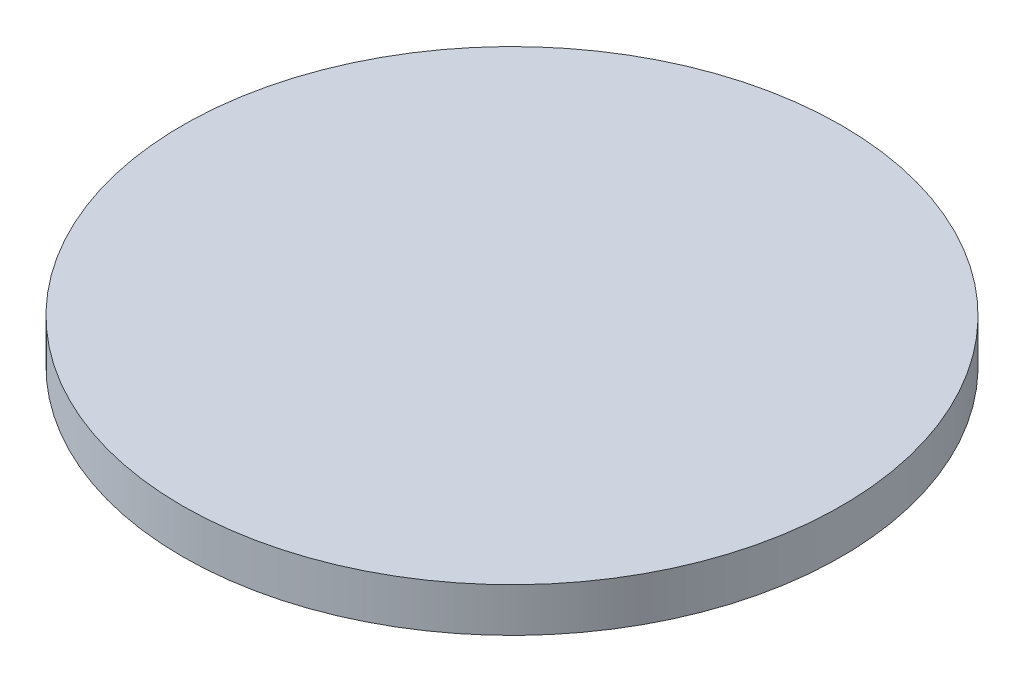
ISO-10303-21;
HEADER;
FILE_DESCRIPTION(('STEP AP214'),'2;1');
FILE_NAME('part.step','',(''),(''),'','','');
FILE_SCHEMA(('AUTOMOTIVE_DESIGN { 1 0 10303 214 1 1 1 1 }'));
ENDSEC;
DATA;
#1=APPLICATION_CONTEXT('core data for automotive mechanical design processes');
#2=APPLICATION_PROTOCOL_DEFINITION('international standard','automotive_design',2000,#1);
#3=PRODUCT_CONTEXT('',#1,'mechanical');
#4=PRODUCT('Part','Part','',(#3));
#5=PRODUCT_RELATED_PRODUCT_CATEGORY('part','',(#4));
#6=PRODUCT_DEFINITION_FORMATION('','',#4);
#7=PRODUCT_DEFINITION_CONTEXT('part definition',#1,'design');
#8=PRODUCT_DEFINITION('design','',#6,#7);
#9=PRODUCT_DEFINITION_SHAPE('','',#8);
#10=(LENGTH_UNIT() NAMED_UNIT(*) SI_UNIT(.MILLI.,.METRE.));
#11=(NAMED_UNIT(*) PLANE_ANGLE_UNIT() SI_UNIT($,.RADIAN.));
#12=(NAMED_UNIT(*) SI_UNIT($,.STERADIAN.) SOLID_ANGLE_UNIT());
#13=UNCERTAINTY_MEASURE_WITH_UNIT(LENGTH_MEASURE(1.E-05),#10,'distance_accuracy_value','');
#14=(GEOMETRIC_REPRESENTATION_CONTEXT(3) GLOBAL_UNCERTAINTY_ASSIGNED_CONTEXT((#13)) GLOBAL_UNIT_ASSIGNED_CONTEXT((#10,
#11,#12)) REPRESENTATION_CONTEXT('',''));
#15=CARTESIAN_POINT('',(0.,0.,0.));
#16=DIRECTION('',(0.,0.,1.));
#17=DIRECTION('',(1.,0.,0.));
#18=AXIS2_PLACEMENT_3D('',#15,#16,#17);
#19=CARTESIAN_POINT('',(0.,112.,0.));
#20=DIRECTION('',(0.,-1.,0.));
#21=DIRECTION('',(0.,0.,-1.));
#22=AXIS2_PLACEMENT_3D('',#19,#20,#21);
#23=CYLINDRICAL_SURFACE('',#22,30.);
#24=CARTESIAN_POINT('',(0.,112.,0.));
#25=DIRECTION('',(0.,1.,0.));
#26=DIRECTION('',(0.,0.,1.));
#27=AXIS2_PLACEMENT_3D('',#24,#25,#26);
#28=CIRCLE('',#27,30.);
#29=CARTESIAN_POINT('',(0.,112.,30.));
#30=VERTEX_POINT('',#29);
#31=EDGE_CURVE('E10',#30,#30,#28,.T.);
#32=ORIENTED_EDGE('',*,*,#31,.F.);
#33=EDGE_LOOP('',(#32));
#34=FACE_BOUND('',#33,.T.);
#35=CARTESIAN_POINT('',(0.,108.,0.));
#36=DIRECTION('',(0.,1.,0.));
#37=DIRECTION('',(0.,0.,1.));
#38=AXIS2_PLACEMENT_3D('',#35,#36,#37);
#39=CIRCLE('',#38,30.);
#40=CARTESIAN_POINT('',(0.,108.,30.));
#41=VERTEX_POINT('',#40);
#42=EDGE_CURVE('E40',#41,#41,#39,.T.);
#43=ORIENTED_EDGE('',*,*,#42,.T.);
#44=EDGE_LOOP('',(#43));
#45=FACE_BOUND('',#44,.T.);
#46=ADVANCED_FACE('F37',(#34,#45),#23,.T.);
#47=CARTESIAN_POINT('',(0.,112.,0.));
#48=DIRECTION('',(0.,1.,0.));
#49=DIRECTION('',(0.,0.,1.));
#50=AXIS2_PLACEMENT_3D('',#47,#48,#49);
#51=PLANE('',#50);
#52=ORIENTED_EDGE('',*,*,#31,.T.);
#53=EDGE_LOOP('',(#52));
#54=FACE_BOUND('',#53,.T.);
#55=ADVANCED_FACE('F52',(#54),#51,.T.);
#56=CARTESIAN_POINT('',(0.,108.,0.));
#57=DIRECTION('',(0.,1.,0.));
#58=DIRECTION('',(0.,0.,1.));
#59=AXIS2_PLACEMENT_3D('',#56,#57,#58);
#60=PLANE('',#59);
#61=ORIENTED_EDGE('',*,*,#42,.F.);
#62=EDGE_LOOP('',(#61));
#63=FACE_BOUND('',#62,.T.);
#64=ADVANCED_FACE('F50',(#63),#60,.F.);
#65=CLOSED_SHELL('',(#46,#55,#64));
#66=MANIFOLD_SOLID_BREP('B2',#65);
#67=ADVANCED_BREP_SHAPE_REPRESENTATION('',(#18,#66),#14);
#68=SHAPE_DEFINITION_REPRESENTATION(#9,#67);
ENDSEC;
END-ISO-10303-21;
